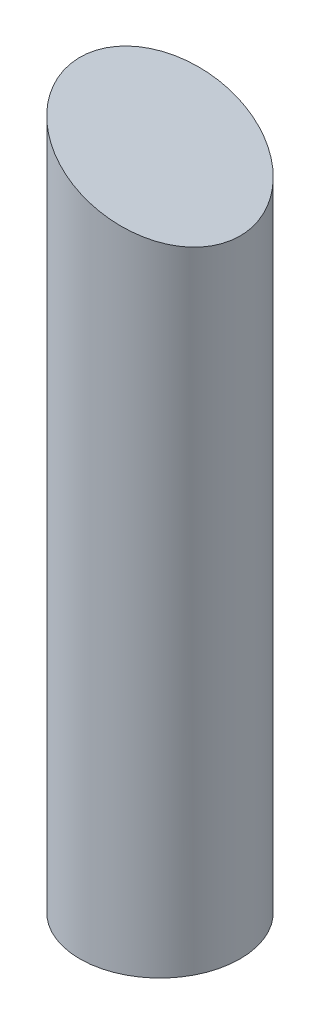
ISO-10303-21;
HEADER;
FILE_DESCRIPTION(('STEP AP214'),'2;1');
FILE_NAME('part.step','',(''),(''),'','','');
FILE_SCHEMA(('AUTOMOTIVE_DESIGN { 1 0 10303 214 1 1 1 1 }'));
ENDSEC;
DATA;
#1=APPLICATION_CONTEXT('core data for automotive mechanical design processes');
#2=APPLICATION_PROTOCOL_DEFINITION('international standard','automotive_design',2000,#1);
#3=PRODUCT_CONTEXT('',#1,'mechanical');
#4=PRODUCT('Part','Part','',(#3));
#5=PRODUCT_RELATED_PRODUCT_CATEGORY('part','',(#4));
#6=PRODUCT_DEFINITION_FORMATION('','',#4);
#7=PRODUCT_DEFINITION_CONTEXT('part definition',#1,'design');
#8=PRODUCT_DEFINITION('design','',#6,#7);
#9=PRODUCT_DEFINITION_SHAPE('','',#8);
#10=(LENGTH_UNIT() NAMED_UNIT(*) SI_UNIT(.MILLI.,.METRE.));
#11=(NAMED_UNIT(*) PLANE_ANGLE_UNIT() SI_UNIT($,.RADIAN.));
#12=(NAMED_UNIT(*) SI_UNIT($,.STERADIAN.) SOLID_ANGLE_UNIT());
#13=UNCERTAINTY_MEASURE_WITH_UNIT(LENGTH_MEASURE(1.E-05),#10,'distance_accuracy_value','');
#14=(GEOMETRIC_REPRESENTATION_CONTEXT(3) GLOBAL_UNCERTAINTY_ASSIGNED_CONTEXT((#13)) GLOBAL_UNIT_ASSIGNED_CONTEXT((#10,
#11,#12)) REPRESENTATION_CONTEXT('',''));
#15=CARTESIAN_POINT('',(0.,0.,0.));
#16=DIRECTION('',(0.,0.,1.));
#17=DIRECTION('',(1.,0.,0.));
#18=AXIS2_PLACEMENT_3D('',#15,#16,#17);
#19=CARTESIAN_POINT('',(0.,35.,0.));
#20=DIRECTION('',(0.,-1.,0.));
#21=DIRECTION('',(0.,0.,-1.));
#22=AXIS2_PLACEMENT_3D('',#19,#20,#21);
#23=CYLINDRICAL_SURFACE('',#22,4.);
#24=CARTESIAN_POINT('',(0.,33.13476936738,0.));
#25=DIRECTION('',(-0.422618261740694,-0.906307787036653,0.));
#26=DIRECTION('',(0.906307787036653,-0.422618261740694,0.));
#27=AXIS2_PLACEMENT_3D('',#24,#25,#26);
#28=ELLIPSE('',#27,4.41351167584995,4.);
#29=CARTESIAN_POINT('',(4.,31.2695387347601,0.));
#30=VERTEX_POINT('',#29);
#31=EDGE_CURVE('E44',#30,#30,#28,.T.);
#32=ORIENTED_EDGE('',*,*,#31,.T.);
#33=EDGE_LOOP('',(#32));
#34=FACE_BOUND('',#33,.T.);
#35=CARTESIAN_POINT('',(0.,0.,0.));
#36=DIRECTION('',(0.,1.,0.));
#37=DIRECTION('',(0.,0.,1.));
#38=AXIS2_PLACEMENT_3D('',#35,#36,#37);
#39=CIRCLE('',#38,4.);
#40=CARTESIAN_POINT('',(0.,0.,4.));
#41=VERTEX_POINT('',#40);
#42=EDGE_CURVE('E10',#41,#41,#39,.T.);
#43=ORIENTED_EDGE('',*,*,#42,.T.);
#44=EDGE_LOOP('',(#43));
#45=FACE_BOUND('',#44,.T.);
#46=ADVANCED_FACE('F37',(#34,#45),#23,.T.);
#47=CARTESIAN_POINT('',(0.,0.,0.));
#48=DIRECTION('',(0.,1.,0.));
#49=DIRECTION('',(0.,0.,1.));
#50=AXIS2_PLACEMENT_3D('',#47,#48,#49);
#51=PLANE('',#50);
#52=ORIENTED_EDGE('',*,*,#42,.F.);
#53=EDGE_LOOP('',(#52));
#54=FACE_BOUND('',#53,.T.);
#55=ADVANCED_FACE('F54',(#54),#51,.F.);
#56=CARTESIAN_POINT('',(-4.,35.,-6.));
#57=DIRECTION('',(-0.422618261740694,-0.906307787036653,0.));
#58=DIRECTION('',(0.906307787036653,-0.422618261740694,0.));
#59=AXIS2_PLACEMENT_3D('',#56,#57,#58);
#60=PLANE('',#59);
#61=ORIENTED_EDGE('',*,*,#31,.F.);
#62=EDGE_LOOP('',(#61));
#63=FACE_BOUND('',#62,.T.);
#64=ADVANCED_FACE('F52',(#63),#60,.F.);
#65=CLOSED_SHELL('',(#46,#55,#64));
#66=MANIFOLD_SOLID_BREP('B2',#65);
#67=ADVANCED_BREP_SHAPE_REPRESENTATION('',(#18,#66),#14);
#68=SHAPE_DEFINITION_REPRESENTATION(#9,#67);
ENDSEC;
END-ISO-10303-21;
